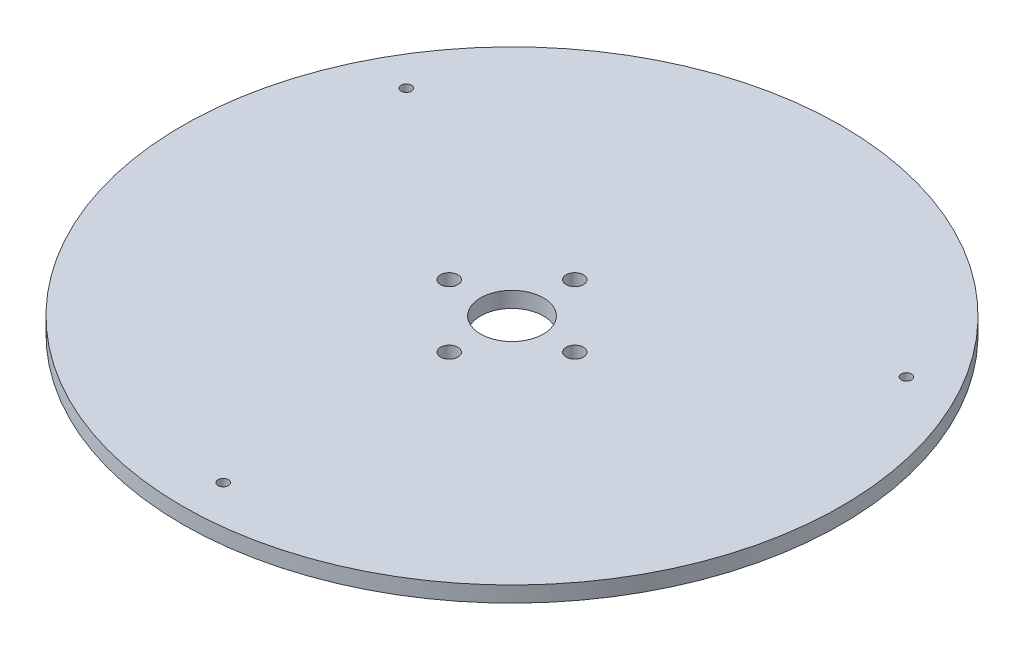
ISO-10303-21;
HEADER;
FILE_DESCRIPTION(('STEP AP214'),'2;1');
FILE_NAME('part.step','',(''),(''),'','','');
FILE_SCHEMA(('AUTOMOTIVE_DESIGN { 1 0 10303 214 1 1 1 1 }'));
ENDSEC;
DATA;
#1=APPLICATION_CONTEXT('core data for automotive mechanical design processes');
#2=APPLICATION_PROTOCOL_DEFINITION('international standard','automotive_design',2000,#1);
#3=PRODUCT_CONTEXT('',#1,'mechanical');
#4=PRODUCT('Part','Part','',(#3));
#5=PRODUCT_RELATED_PRODUCT_CATEGORY('part','',(#4));
#6=PRODUCT_DEFINITION_FORMATION('','',#4);
#7=PRODUCT_DEFINITION_CONTEXT('part definition',#1,'design');
#8=PRODUCT_DEFINITION('design','',#6,#7);
#9=PRODUCT_DEFINITION_SHAPE('','',#8);
#10=(LENGTH_UNIT() NAMED_UNIT(*) SI_UNIT(.MILLI.,.METRE.));
#11=(NAMED_UNIT(*) PLANE_ANGLE_UNIT() SI_UNIT($,.RADIAN.));
#12=(NAMED_UNIT(*) SI_UNIT($,.STERADIAN.) SOLID_ANGLE_UNIT());
#13=UNCERTAINTY_MEASURE_WITH_UNIT(LENGTH_MEASURE(1.E-05),#10,'distance_accuracy_value','');
#14=(GEOMETRIC_REPRESENTATION_CONTEXT(3) GLOBAL_UNCERTAINTY_ASSIGNED_CONTEXT((#13)) GLOBAL_UNIT_ASSIGNED_CONTEXT((#10,
#11,#12)) REPRESENTATION_CONTEXT('',''));
#15=CARTESIAN_POINT('',(0.,0.,0.));
#16=DIRECTION('',(0.,0.,1.));
#17=DIRECTION('',(1.,0.,0.));
#18=AXIS2_PLACEMENT_3D('',#15,#16,#17);
#19=CARTESIAN_POINT('',(0.,5.,0.));
#20=DIRECTION('',(0.,1.,0.));
#21=DIRECTION('',(0.,0.,1.));
#22=AXIS2_PLACEMENT_3D('',#19,#20,#21);
#23=PLANE('',#22);
#24=CARTESIAN_POINT('',(20.,5.,2.09488880330588E-13));
#25=DIRECTION('',(0.,1.,0.));
#26=DIRECTION('',(0.,0.,1.));
#27=AXIS2_PLACEMENT_3D('',#24,#25,#26);
#28=CIRCLE('',#27,2.75);
#29=CARTESIAN_POINT('',(20.,5.,2.75000000000021));
#30=VERTEX_POINT('',#29);
#31=EDGE_CURVE('E111',#30,#30,#28,.T.);
#32=ORIENTED_EDGE('',*,*,#31,.F.);
#33=EDGE_LOOP('',(#32));
#34=FACE_BOUND('',#33,.T.);
#35=CARTESIAN_POINT('',(0.,5.,-20.));
#36=DIRECTION('',(0.,1.,0.));
#37=DIRECTION('',(0.,0.,1.));
#38=AXIS2_PLACEMENT_3D('',#35,#36,#37);
#39=CIRCLE('',#38,2.75);
#40=CARTESIAN_POINT('',(0.,5.,-17.25));
#41=VERTEX_POINT('',#40);
#42=EDGE_CURVE('E103',#41,#41,#39,.T.);
#43=ORIENTED_EDGE('',*,*,#42,.F.);
#44=EDGE_LOOP('',(#43));
#45=FACE_BOUND('',#44,.T.);
#46=CARTESIAN_POINT('',(-20.,5.,0.));
#47=DIRECTION('',(0.,1.,0.));
#48=DIRECTION('',(0.,0.,1.));
#49=AXIS2_PLACEMENT_3D('',#46,#47,#48);
#50=CIRCLE('',#49,2.75);
#51=CARTESIAN_POINT('',(-20.,5.,2.74999999999993));
#52=VERTEX_POINT('',#51);
#53=EDGE_CURVE('E95',#52,#52,#50,.T.);
#54=ORIENTED_EDGE('',*,*,#53,.F.);
#55=EDGE_LOOP('',(#54));
#56=FACE_BOUND('',#55,.T.);
#57=CARTESIAN_POINT('',(0.,5.,20.));
#58=DIRECTION('',(0.,1.,0.));
#59=DIRECTION('',(0.,0.,1.));
#60=AXIS2_PLACEMENT_3D('',#57,#58,#59);
#61=CIRCLE('',#60,2.75);
#62=CARTESIAN_POINT('',(0.,5.,22.75));
#63=VERTEX_POINT('',#62);
#64=EDGE_CURVE('E87',#63,#63,#61,.T.);
#65=ORIENTED_EDGE('',*,*,#64,.F.);
#66=EDGE_LOOP('',(#65));
#67=FACE_BOUND('',#66,.T.);
#68=CARTESIAN_POINT('',(79.6743371481688,5.,-45.9999999999993));
#69=DIRECTION('',(0.,1.,0.));
#70=DIRECTION('',(0.,0.,1.));
#71=AXIS2_PLACEMENT_3D('',#68,#69,#70);
#72=CIRCLE('',#71,1.64999999999998);
#73=CARTESIAN_POINT('',(79.6743371481688,5.,-44.3499999999993));
#74=VERTEX_POINT('',#73);
#75=EDGE_CURVE('E79',#74,#74,#72,.T.);
#76=ORIENTED_EDGE('',*,*,#75,.F.);
#77=EDGE_LOOP('',(#76));
#78=FACE_BOUND('',#77,.T.);
#79=CARTESIAN_POINT('',(-79.6743371481682,5.,-46.0000000000004));
#80=DIRECTION('',(0.,1.,0.));
#81=DIRECTION('',(0.,0.,1.));
#82=AXIS2_PLACEMENT_3D('',#79,#80,#81);
#83=CIRCLE('',#82,1.64999999999998);
#84=CARTESIAN_POINT('',(-79.6743371481682,5.,-44.3500000000004));
#85=VERTEX_POINT('',#84);
#86=EDGE_CURVE('E71',#85,#85,#83,.T.);
#87=ORIENTED_EDGE('',*,*,#86,.F.);
#88=EDGE_LOOP('',(#87));
#89=FACE_BOUND('',#88,.T.);
#90=CARTESIAN_POINT('',(0.,5.,92.));
#91=DIRECTION('',(0.,1.,0.));
#92=DIRECTION('',(0.,0.,1.));
#93=AXIS2_PLACEMENT_3D('',#90,#91,#92);
#94=CIRCLE('',#93,1.64999999999999);
#95=CARTESIAN_POINT('',(0.,5.,93.65));
#96=VERTEX_POINT('',#95);
#97=EDGE_CURVE('E63',#96,#96,#94,.T.);
#98=ORIENTED_EDGE('',*,*,#97,.F.);
#99=EDGE_LOOP('',(#98));
#100=FACE_BOUND('',#99,.T.);
#101=CARTESIAN_POINT('',(0.,5.,0.));
#102=DIRECTION('',(0.,1.,0.));
#103=DIRECTION('',(0.,0.,1.));
#104=AXIS2_PLACEMENT_3D('',#101,#102,#103);
#105=CIRCLE('',#104,105.);
#106=CARTESIAN_POINT('',(0.,5.,105.));
#107=VERTEX_POINT('',#106);
#108=EDGE_CURVE('E10',#107,#107,#105,.T.);
#109=ORIENTED_EDGE('',*,*,#108,.T.);
#110=EDGE_LOOP('',(#109));
#111=FACE_BOUND('',#110,.T.);
#112=CARTESIAN_POINT('',(0.,5.,0.));
#113=DIRECTION('',(0.,1.,0.));
#114=DIRECTION('',(0.,0.,1.));
#115=AXIS2_PLACEMENT_3D('',#112,#113,#114);
#116=CIRCLE('',#115,10.);
#117=CARTESIAN_POINT('',(0.,5.,10.));
#118=VERTEX_POINT('',#117);
#119=EDGE_CURVE('E50',#118,#118,#116,.T.);
#120=ORIENTED_EDGE('',*,*,#119,.F.);
#121=EDGE_LOOP('',(#120));
#122=FACE_BOUND('',#121,.T.);
#123=ADVANCED_FACE('F37',(#34,#45,#56,#67,#78,#89,#100,#111,#122),#23,.T.);
#124=CARTESIAN_POINT('',(0.,0.,0.));
#125=DIRECTION('',(0.,1.,0.));
#126=DIRECTION('',(0.,0.,1.));
#127=AXIS2_PLACEMENT_3D('',#124,#125,#126);
#128=PLANE('',#127);
#129=CARTESIAN_POINT('',(20.,0.,2.09488880330588E-13));
#130=DIRECTION('',(0.,1.,0.));
#131=DIRECTION('',(0.,0.,1.));
#132=AXIS2_PLACEMENT_3D('',#129,#130,#131);
#133=CIRCLE('',#132,2.75);
#134=CARTESIAN_POINT('',(20.,0.,2.75000000000021));
#135=VERTEX_POINT('',#134);
#136=EDGE_CURVE('E107',#135,#135,#133,.T.);
#137=ORIENTED_EDGE('',*,*,#136,.T.);
#138=EDGE_LOOP('',(#137));
#139=FACE_BOUND('',#138,.T.);
#140=CARTESIAN_POINT('',(0.,0.,-20.));
#141=DIRECTION('',(0.,1.,0.));
#142=DIRECTION('',(0.,0.,1.));
#143=AXIS2_PLACEMENT_3D('',#140,#141,#142);
#144=CIRCLE('',#143,2.75);
#145=CARTESIAN_POINT('',(0.,0.,-17.25));
#146=VERTEX_POINT('',#145);
#147=EDGE_CURVE('E99',#146,#146,#144,.T.);
#148=ORIENTED_EDGE('',*,*,#147,.T.);
#149=EDGE_LOOP('',(#148));
#150=FACE_BOUND('',#149,.T.);
#151=CARTESIAN_POINT('',(-20.,0.,0.));
#152=DIRECTION('',(0.,1.,0.));
#153=DIRECTION('',(0.,0.,1.));
#154=AXIS2_PLACEMENT_3D('',#151,#152,#153);
#155=CIRCLE('',#154,2.75);
#156=CARTESIAN_POINT('',(-20.,0.,2.74999999999993));
#157=VERTEX_POINT('',#156);
#158=EDGE_CURVE('E91',#157,#157,#155,.T.);
#159=ORIENTED_EDGE('',*,*,#158,.T.);
#160=EDGE_LOOP('',(#159));
#161=FACE_BOUND('',#160,.T.);
#162=CARTESIAN_POINT('',(0.,0.,20.));
#163=DIRECTION('',(0.,1.,0.));
#164=DIRECTION('',(0.,0.,1.));
#165=AXIS2_PLACEMENT_3D('',#162,#163,#164);
#166=CIRCLE('',#165,2.75);
#167=CARTESIAN_POINT('',(0.,0.,22.75));
#168=VERTEX_POINT('',#167);
#169=EDGE_CURVE('E83',#168,#168,#166,.T.);
#170=ORIENTED_EDGE('',*,*,#169,.T.);
#171=EDGE_LOOP('',(#170));
#172=FACE_BOUND('',#171,.T.);
#173=CARTESIAN_POINT('',(79.6743371481688,0.,-45.9999999999993));
#174=DIRECTION('',(0.,1.,0.));
#175=DIRECTION('',(0.,0.,1.));
#176=AXIS2_PLACEMENT_3D('',#173,#174,#175);
#177=CIRCLE('',#176,1.65);
#178=CARTESIAN_POINT('',(79.6743371481688,0.,-44.3499999999993));
#179=VERTEX_POINT('',#178);
#180=EDGE_CURVE('E75',#179,#179,#177,.T.);
#181=ORIENTED_EDGE('',*,*,#180,.T.);
#182=EDGE_LOOP('',(#181));
#183=FACE_BOUND('',#182,.T.);
#184=CARTESIAN_POINT('',(-79.6743371481682,0.,-46.0000000000004));
#185=DIRECTION('',(0.,1.,0.));
#186=DIRECTION('',(0.,0.,1.));
#187=AXIS2_PLACEMENT_3D('',#184,#185,#186);
#188=CIRCLE('',#187,1.65);
#189=CARTESIAN_POINT('',(-79.6743371481682,0.,-44.3500000000004));
#190=VERTEX_POINT('',#189);
#191=EDGE_CURVE('E67',#190,#190,#188,.T.);
#192=ORIENTED_EDGE('',*,*,#191,.T.);
#193=EDGE_LOOP('',(#192));
#194=FACE_BOUND('',#193,.T.);
#195=CARTESIAN_POINT('',(0.,0.,92.));
#196=DIRECTION('',(0.,1.,0.));
#197=DIRECTION('',(0.,0.,1.));
#198=AXIS2_PLACEMENT_3D('',#195,#196,#197);
#199=CIRCLE('',#198,1.65);
#200=CARTESIAN_POINT('',(0.,0.,93.65));
#201=VERTEX_POINT('',#200);
#202=EDGE_CURVE('E56',#201,#201,#199,.T.);
#203=ORIENTED_EDGE('',*,*,#202,.T.);
#204=EDGE_LOOP('',(#203));
#205=FACE_BOUND('',#204,.T.);
#206=CARTESIAN_POINT('',(0.,0.,0.));
#207=DIRECTION('',(0.,1.,0.));
#208=DIRECTION('',(0.,0.,1.));
#209=AXIS2_PLACEMENT_3D('',#206,#207,#208);
#210=CIRCLE('',#209,105.);
#211=CARTESIAN_POINT('',(0.,0.,105.));
#212=VERTEX_POINT('',#211);
#213=EDGE_CURVE('E41',#212,#212,#210,.T.);
#214=ORIENTED_EDGE('',*,*,#213,.F.);
#215=EDGE_LOOP('',(#214));
#216=FACE_BOUND('',#215,.T.);
#217=CARTESIAN_POINT('',(0.,0.,0.));
#218=DIRECTION('',(0.,1.,0.));
#219=DIRECTION('',(0.,0.,1.));
#220=AXIS2_PLACEMENT_3D('',#217,#218,#219);
#221=CIRCLE('',#220,10.);
#222=CARTESIAN_POINT('',(0.,0.,10.));
#223=VERTEX_POINT('',#222);
#224=EDGE_CURVE('E52',#223,#223,#221,.T.);
#225=ORIENTED_EDGE('',*,*,#224,.T.);
#226=EDGE_LOOP('',(#225));
#227=FACE_BOUND('',#226,.T.);
#228=ADVANCED_FACE('F120',(#139,#150,#161,#172,#183,#194,#205,#216,#227),#128,.F.);
#229=CARTESIAN_POINT('',(0.,5.,0.));
#230=DIRECTION('',(0.,-1.,0.));
#231=DIRECTION('',(0.,0.,-1.));
#232=AXIS2_PLACEMENT_3D('',#229,#230,#231);
#233=CYLINDRICAL_SURFACE('',#232,105.);
#234=ORIENTED_EDGE('',*,*,#108,.F.);
#235=EDGE_LOOP('',(#234));
#236=FACE_BOUND('',#235,.T.);
#237=ORIENTED_EDGE('',*,*,#213,.T.);
#238=EDGE_LOOP('',(#237));
#239=FACE_BOUND('',#238,.T.);
#240=ADVANCED_FACE('F39',(#236,#239),#233,.T.);
#241=CARTESIAN_POINT('',(0.,5.,0.));
#242=DIRECTION('',(0.,-1.,0.));
#243=DIRECTION('',(0.,0.,-1.));
#244=AXIS2_PLACEMENT_3D('',#241,#242,#243);
#245=CYLINDRICAL_SURFACE('',#244,10.);
#246=ORIENTED_EDGE('',*,*,#119,.T.);
#247=EDGE_LOOP('',(#246));
#248=FACE_BOUND('',#247,.T.);
#249=ORIENTED_EDGE('',*,*,#224,.F.);
#250=EDGE_LOOP('',(#249));
#251=FACE_BOUND('',#250,.T.);
#252=ADVANCED_FACE('F136',(#248,#251),#245,.F.);
#253=CARTESIAN_POINT('',(0.,5.,92.));
#254=DIRECTION('',(0.,1.,0.));
#255=DIRECTION('',(0.,0.,1.));
#256=AXIS2_PLACEMENT_3D('',#253,#254,#255);
#257=CYLINDRICAL_SURFACE('',#256,1.64999999999999);
#258=ORIENTED_EDGE('',*,*,#202,.F.);
#259=EDGE_LOOP('',(#258));
#260=FACE_BOUND('',#259,.T.);
#261=ORIENTED_EDGE('',*,*,#97,.T.);
#262=EDGE_LOOP('',(#261));
#263=FACE_BOUND('',#262,.T.);
#264=ADVANCED_FACE('F139',(#260,#263),#257,.F.);
#265=CARTESIAN_POINT('',(-79.6743371481682,5.,-46.0000000000004));
#266=DIRECTION('',(0.,1.,0.));
#267=DIRECTION('',(0.,0.,1.));
#268=AXIS2_PLACEMENT_3D('',#265,#266,#267);
#269=CYLINDRICAL_SURFACE('',#268,1.64999999999999);
#270=ORIENTED_EDGE('',*,*,#191,.F.);
#271=EDGE_LOOP('',(#270));
#272=FACE_BOUND('',#271,.T.);
#273=ORIENTED_EDGE('',*,*,#86,.T.);
#274=EDGE_LOOP('',(#273));
#275=FACE_BOUND('',#274,.T.);
#276=ADVANCED_FACE('F153',(#272,#275),#269,.F.);
#277=CARTESIAN_POINT('',(79.6743371481688,5.,-45.9999999999993));
#278=DIRECTION('',(0.,1.,0.));
#279=DIRECTION('',(0.,0.,1.));
#280=AXIS2_PLACEMENT_3D('',#277,#278,#279);
#281=CYLINDRICAL_SURFACE('',#280,1.64999999999999);
#282=ORIENTED_EDGE('',*,*,#180,.F.);
#283=EDGE_LOOP('',(#282));
#284=FACE_BOUND('',#283,.T.);
#285=ORIENTED_EDGE('',*,*,#75,.T.);
#286=EDGE_LOOP('',(#285));
#287=FACE_BOUND('',#286,.T.);
#288=ADVANCED_FACE('F157',(#284,#287),#281,.F.);
#289=CARTESIAN_POINT('',(0.,5.,20.));
#290=DIRECTION('',(0.,1.,0.));
#291=DIRECTION('',(0.,0.,1.));
#292=AXIS2_PLACEMENT_3D('',#289,#290,#291);
#293=CYLINDRICAL_SURFACE('',#292,2.75);
#294=ORIENTED_EDGE('',*,*,#169,.F.);
#295=EDGE_LOOP('',(#294));
#296=FACE_BOUND('',#295,.T.);
#297=ORIENTED_EDGE('',*,*,#64,.T.);
#298=EDGE_LOOP('',(#297));
#299=FACE_BOUND('',#298,.T.);
#300=ADVANCED_FACE('F161',(#296,#299),#293,.F.);
#301=CARTESIAN_POINT('',(-20.,5.,0.));
#302=DIRECTION('',(0.,1.,0.));
#303=DIRECTION('',(0.,0.,1.));
#304=AXIS2_PLACEMENT_3D('',#301,#302,#303);
#305=CYLINDRICAL_SURFACE('',#304,2.75);
#306=ORIENTED_EDGE('',*,*,#158,.F.);
#307=EDGE_LOOP('',(#306));
#308=FACE_BOUND('',#307,.T.);
#309=ORIENTED_EDGE('',*,*,#53,.T.);
#310=EDGE_LOOP('',(#309));
#311=FACE_BOUND('',#310,.T.);
#312=ADVANCED_FACE('F165',(#308,#311),#305,.F.);
#313=CARTESIAN_POINT('',(0.,5.,-20.));
#314=DIRECTION('',(0.,1.,0.));
#315=DIRECTION('',(0.,0.,1.));
#316=AXIS2_PLACEMENT_3D('',#313,#314,#315);
#317=CYLINDRICAL_SURFACE('',#316,2.75);
#318=ORIENTED_EDGE('',*,*,#147,.F.);
#319=EDGE_LOOP('',(#318));
#320=FACE_BOUND('',#319,.T.);
#321=ORIENTED_EDGE('',*,*,#42,.T.);
#322=EDGE_LOOP('',(#321));
#323=FACE_BOUND('',#322,.T.);
#324=ADVANCED_FACE('F169',(#320,#323),#317,.F.);
#325=CARTESIAN_POINT('',(20.,5.,2.09488880330588E-13));
#326=DIRECTION('',(0.,1.,0.));
#327=DIRECTION('',(0.,0.,1.));
#328=AXIS2_PLACEMENT_3D('',#325,#326,#327);
#329=CYLINDRICAL_SURFACE('',#328,2.75);
#330=ORIENTED_EDGE('',*,*,#136,.F.);
#331=EDGE_LOOP('',(#330));
#332=FACE_BOUND('',#331,.T.);
#333=ORIENTED_EDGE('',*,*,#31,.T.);
#334=EDGE_LOOP('',(#333));
#335=FACE_BOUND('',#334,.T.);
#336=ADVANCED_FACE('F116',(#332,#335),#329,.F.);
#337=CLOSED_SHELL('',(#123,#228,#240,#252,#264,#276,#288,#300,#312,#324,#336));
#338=MANIFOLD_SOLID_BREP('B2',#337);
#339=ADVANCED_BREP_SHAPE_REPRESENTATION('',(#18,#338),#14);
#340=SHAPE_DEFINITION_REPRESENTATION(#9,#339);
ENDSEC;
END-ISO-10303-21;
